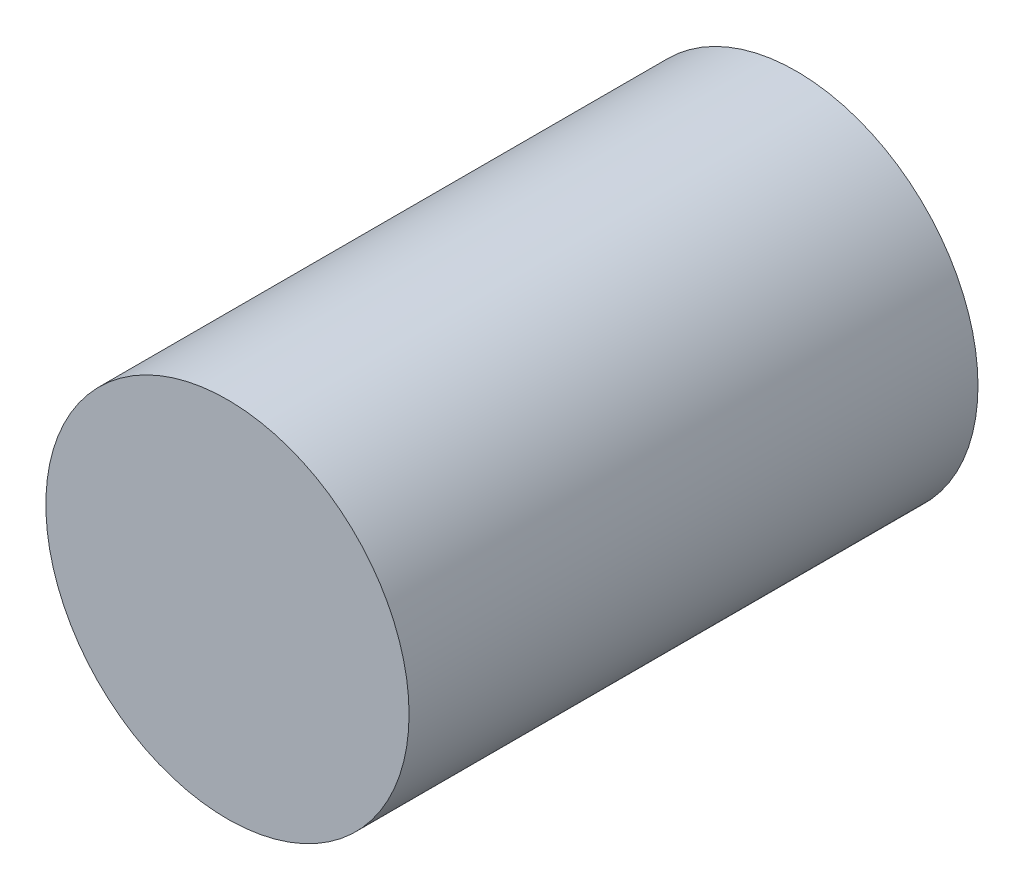
ISO-10303-21;
HEADER;
FILE_DESCRIPTION(('STEP AP214'),'2;1');
FILE_NAME('part.step','',(''),(''),'','','');
FILE_SCHEMA(('AUTOMOTIVE_DESIGN { 1 0 10303 214 1 1 1 1 }'));
ENDSEC;
DATA;
#1=APPLICATION_CONTEXT('core data for automotive mechanical design processes');
#2=APPLICATION_PROTOCOL_DEFINITION('international standard','automotive_design',2000,#1);
#3=PRODUCT_CONTEXT('',#1,'mechanical');
#4=PRODUCT('Part','Part','',(#3));
#5=PRODUCT_RELATED_PRODUCT_CATEGORY('part','',(#4));
#6=PRODUCT_DEFINITION_FORMATION('','',#4);
#7=PRODUCT_DEFINITION_CONTEXT('part definition',#1,'design');
#8=PRODUCT_DEFINITION('design','',#6,#7);
#9=PRODUCT_DEFINITION_SHAPE('','',#8);
#10=(LENGTH_UNIT() NAMED_UNIT(*) SI_UNIT(.MILLI.,.METRE.));
#11=(NAMED_UNIT(*) PLANE_ANGLE_UNIT() SI_UNIT($,.RADIAN.));
#12=(NAMED_UNIT(*) SI_UNIT($,.STERADIAN.) SOLID_ANGLE_UNIT());
#13=UNCERTAINTY_MEASURE_WITH_UNIT(LENGTH_MEASURE(1.E-05),#10,'distance_accuracy_value','');
#14=(GEOMETRIC_REPRESENTATION_CONTEXT(3) GLOBAL_UNCERTAINTY_ASSIGNED_CONTEXT((#13)) GLOBAL_UNIT_ASSIGNED_CONTEXT((#10,
#11,#12)) REPRESENTATION_CONTEXT('',''));
#15=CARTESIAN_POINT('',(0.,0.,0.));
#16=DIRECTION('',(0.,0.,1.));
#17=DIRECTION('',(1.,0.,0.));
#18=AXIS2_PLACEMENT_3D('',#15,#16,#17);
#19=CARTESIAN_POINT('',(0.,0.,14.63));
#20=DIRECTION('',(0.,0.,-1.));
#21=DIRECTION('',(-1.,0.,0.));
#22=AXIS2_PLACEMENT_3D('',#19,#20,#21);
#23=CYLINDRICAL_SURFACE('',#22,4.67);
#24=CARTESIAN_POINT('',(0.,0.,14.63));
#25=DIRECTION('',(0.,0.,1.));
#26=DIRECTION('',(1.,0.,0.));
#27=AXIS2_PLACEMENT_3D('',#24,#25,#26);
#28=CIRCLE('',#27,4.67);
#29=CARTESIAN_POINT('',(4.67,0.,14.63));
#30=VERTEX_POINT('',#29);
#31=EDGE_CURVE('E13',#30,#30,#28,.T.);
#32=ORIENTED_EDGE('',*,*,#31,.F.);
#33=EDGE_LOOP('',(#32));
#34=FACE_BOUND('',#33,.T.);
#35=CARTESIAN_POINT('',(0.,0.,0.));
#36=DIRECTION('',(0.,0.,1.));
#37=DIRECTION('',(1.,0.,0.));
#38=AXIS2_PLACEMENT_3D('',#35,#36,#37);
#39=CIRCLE('',#38,4.67);
#40=CARTESIAN_POINT('',(4.67,0.,0.));
#41=VERTEX_POINT('',#40);
#42=EDGE_CURVE('E77',#41,#41,#39,.T.);
#43=ORIENTED_EDGE('',*,*,#42,.T.);
#44=EDGE_LOOP('',(#43));
#45=FACE_BOUND('',#44,.T.);
#46=ADVANCED_FACE('F73',(#34,#45),#23,.T.);
#47=CARTESIAN_POINT('',(0.,0.,14.63));
#48=DIRECTION('',(0.,0.,1.));
#49=DIRECTION('',(1.,0.,0.));
#50=AXIS2_PLACEMENT_3D('',#47,#48,#49);
#51=PLANE('',#50);
#52=ORIENTED_EDGE('',*,*,#31,.T.);
#53=EDGE_LOOP('',(#52));
#54=FACE_BOUND('',#53,.T.);
#55=ADVANCED_FACE('F89',(#54),#51,.T.);
#56=CARTESIAN_POINT('',(0.,0.,0.));
#57=DIRECTION('',(0.,0.,1.));
#58=DIRECTION('',(1.,0.,0.));
#59=AXIS2_PLACEMENT_3D('',#56,#57,#58);
#60=PLANE('',#59);
#61=ORIENTED_EDGE('',*,*,#42,.F.);
#62=EDGE_LOOP('',(#61));
#63=FACE_BOUND('',#62,.T.);
#64=ADVANCED_FACE('F86',(#63),#60,.F.);
#65=CLOSED_SHELL('',(#46,#55,#64));
#66=MANIFOLD_SOLID_BREP('B2',#65);
#67=ADVANCED_BREP_SHAPE_REPRESENTATION('',(#18,#66),#14);
#68=SHAPE_DEFINITION_REPRESENTATION(#9,#67);
ENDSEC;
END-ISO-10303-21;
